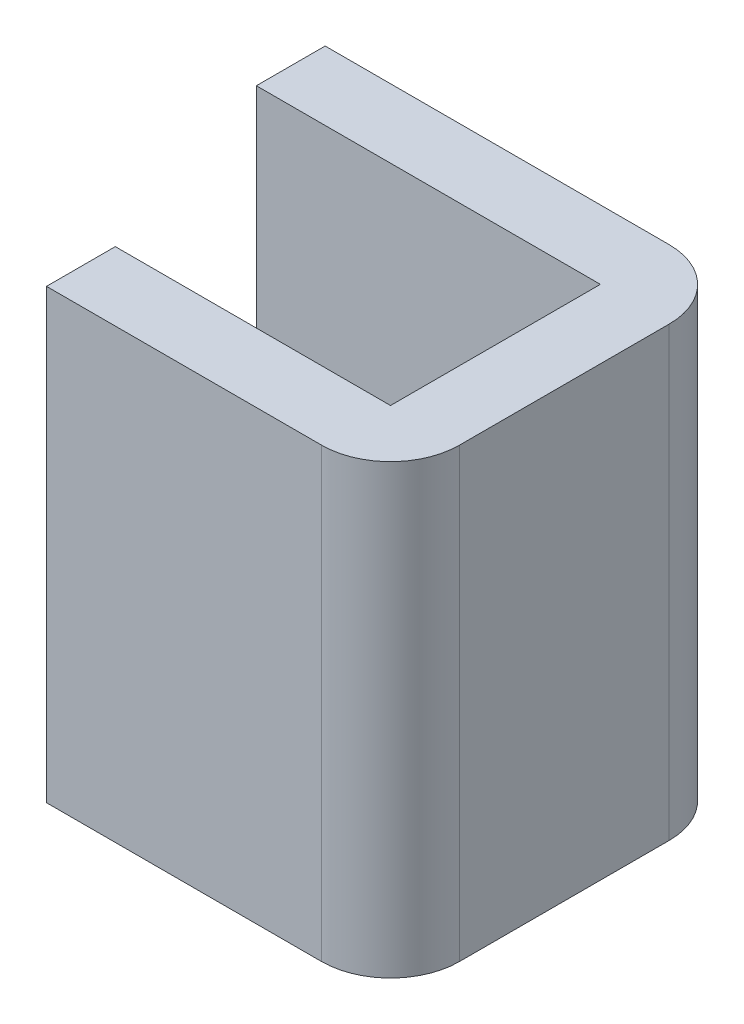
ISO-10303-21;
HEADER;
FILE_DESCRIPTION(('STEP AP214'),'2;1');
FILE_NAME('part.step','',(''),(''),'','','');
FILE_SCHEMA(('AUTOMOTIVE_DESIGN { 1 0 10303 214 1 1 1 1 }'));
ENDSEC;
DATA;
#1=APPLICATION_CONTEXT('core data for automotive mechanical design processes');
#2=APPLICATION_PROTOCOL_DEFINITION('international standard','automotive_design',2000,#1);
#3=PRODUCT_CONTEXT('',#1,'mechanical');
#4=PRODUCT('Part','Part','',(#3));
#5=PRODUCT_RELATED_PRODUCT_CATEGORY('part','',(#4));
#6=PRODUCT_DEFINITION_FORMATION('','',#4);
#7=PRODUCT_DEFINITION_CONTEXT('part definition',#1,'design');
#8=PRODUCT_DEFINITION('design','',#6,#7);
#9=PRODUCT_DEFINITION_SHAPE('','',#8);
#10=(LENGTH_UNIT() NAMED_UNIT(*) SI_UNIT(.MILLI.,.METRE.));
#11=(NAMED_UNIT(*) PLANE_ANGLE_UNIT() SI_UNIT($,.RADIAN.));
#12=(NAMED_UNIT(*) SI_UNIT($,.STERADIAN.) SOLID_ANGLE_UNIT());
#13=UNCERTAINTY_MEASURE_WITH_UNIT(LENGTH_MEASURE(1.E-05),#10,'distance_accuracy_value','');
#14=(GEOMETRIC_REPRESENTATION_CONTEXT(3) GLOBAL_UNCERTAINTY_ASSIGNED_CONTEXT((#13)) GLOBAL_UNIT_ASSIGNED_CONTEXT((#10,
#11,#12)) REPRESENTATION_CONTEXT('',''));
#15=CARTESIAN_POINT('',(0.,0.,0.));
#16=DIRECTION('',(0.,0.,1.));
#17=DIRECTION('',(1.,0.,0.));
#18=AXIS2_PLACEMENT_3D('',#15,#16,#17);
#19=CARTESIAN_POINT('',(0.575,0.,0.505));
#20=DIRECTION('',(0.,0.,1.));
#21=DIRECTION('',(1.,0.,0.));
#22=AXIS2_PLACEMENT_3D('',#19,#20,#21);
#23=PLANE('',#22);
#24=DIRECTION('',(-1.,0.,0.));
#25=VECTOR('',#24,1.);
#26=CARTESIAN_POINT('',(0.578986710963,0.325,0.505));
#27=LINE('',#26,#25);
#28=CARTESIAN_POINT('',(0.325,0.325,0.505));
#29=VERTEX_POINT('',#28);
#30=CARTESIAN_POINT('',(0.725,0.325,0.505));
#31=VERTEX_POINT('',#30);
#32=EDGE_CURVE('E149',#29,#31,#27,.F.);
#33=ORIENTED_EDGE('',*,*,#32,.F.);
#34=DIRECTION('',(0.,1.,0.));
#35=VECTOR('',#34,1.);
#36=CARTESIAN_POINT('',(0.325,-0.325,0.505));
#37=LINE('',#36,#35);
#38=CARTESIAN_POINT('',(0.325,-0.325,0.505));
#39=VERTEX_POINT('',#38);
#40=EDGE_CURVE('E78',#29,#39,#37,.F.);
#41=ORIENTED_EDGE('',*,*,#40,.T.);
#42=DIRECTION('',(1.,0.,0.));
#43=VECTOR('',#42,1.);
#44=CARTESIAN_POINT('',(0.578986710963,-0.325,0.505));
#45=LINE('',#44,#43);
#46=CARTESIAN_POINT('',(0.725,-0.325,0.505));
#47=VERTEX_POINT('',#46);
#48=EDGE_CURVE('E139',#47,#39,#45,.F.);
#49=ORIENTED_EDGE('',*,*,#48,.F.);
#50=DIRECTION('',(0.,1.,0.));
#51=VECTOR('',#50,1.);
#52=CARTESIAN_POINT('',(0.725,-0.325,0.505));
#53=LINE('',#52,#51);
#54=EDGE_CURVE('E70',#31,#47,#53,.F.);
#55=ORIENTED_EDGE('',*,*,#54,.F.);
#56=EDGE_LOOP('',(#33,#41,#49,#55));
#57=FACE_BOUND('',#56,.T.);
#58=ADVANCED_FACE('F17',(#57),#23,.T.);
#59=CARTESIAN_POINT('',(0.725,-0.325,0.405));
#60=DIRECTION('',(0.,1.,0.));
#61=DIRECTION('',(0.,0.,1.));
#62=AXIS2_PLACEMENT_3D('',#59,#60,#61);
#63=CYLINDRICAL_SURFACE('',#62,0.1);
#64=ORIENTED_EDGE('',*,*,#54,.T.);
#65=CARTESIAN_POINT('',(0.725,-0.325,0.405));
#66=DIRECTION('',(0.,1.,0.));
#67=DIRECTION('',(0.,0.,1.));
#68=AXIS2_PLACEMENT_3D('',#65,#66,#67);
#69=CIRCLE('',#68,0.1);
#70=CARTESIAN_POINT('',(0.825,-0.325,0.405));
#71=VERTEX_POINT('',#70);
#72=EDGE_CURVE('E20',#71,#47,#69,.F.);
#73=ORIENTED_EDGE('',*,*,#72,.F.);
#74=DIRECTION('',(0.,1.,0.));
#75=VECTOR('',#74,1.);
#76=CARTESIAN_POINT('',(0.825,-0.325,0.405));
#77=LINE('',#76,#75);
#78=CARTESIAN_POINT('',(0.825,0.325,0.405));
#79=VERTEX_POINT('',#78);
#80=EDGE_CURVE('E64',#79,#71,#77,.F.);
#81=ORIENTED_EDGE('',*,*,#80,.F.);
#82=CARTESIAN_POINT('',(0.725,0.325,0.405));
#83=DIRECTION('',(0.,1.,0.));
#84=DIRECTION('',(0.,0.,1.));
#85=AXIS2_PLACEMENT_3D('',#82,#83,#84);
#86=CIRCLE('',#85,0.1);
#87=EDGE_CURVE('E206',#31,#79,#86,.T.);
#88=ORIENTED_EDGE('',*,*,#87,.F.);
#89=EDGE_LOOP('',(#64,#73,#81,#88));
#90=FACE_BOUND('',#89,.T.);
#91=ADVANCED_FACE('F235',(#90),#63,.T.);
#92=CARTESIAN_POINT('',(0.225,-0.325,0.1));
#93=DIRECTION('',(0.,0.,1.));
#94=DIRECTION('',(1.,0.,0.));
#95=AXIS2_PLACEMENT_3D('',#92,#93,#94);
#96=PLANE('',#95);
#97=DIRECTION('',(0.,1.,0.));
#98=VECTOR('',#97,1.);
#99=CARTESIAN_POINT('',(0.725,-0.325,0.1));
#100=LINE('',#99,#98);
#101=CARTESIAN_POINT('',(0.725,-0.325,0.1));
#102=VERTEX_POINT('',#101);
#103=CARTESIAN_POINT('',(0.725,0.325,0.1));
#104=VERTEX_POINT('',#103);
#105=EDGE_CURVE('E100',#102,#104,#100,.T.);
#106=ORIENTED_EDGE('',*,*,#105,.T.);
#107=DIRECTION('',(-1.,0.,0.));
#108=VECTOR('',#107,1.);
#109=CARTESIAN_POINT('',(0.578986710963,0.325,0.1));
#110=LINE('',#109,#108);
#111=CARTESIAN_POINT('',(0.225,0.325,0.1));
#112=VERTEX_POINT('',#111);
#113=EDGE_CURVE('E152',#112,#104,#110,.F.);
#114=ORIENTED_EDGE('',*,*,#113,.F.);
#115=DIRECTION('',(0.,1.,0.));
#116=VECTOR('',#115,1.);
#117=CARTESIAN_POINT('',(0.225,-0.325,0.1));
#118=LINE('',#117,#116);
#119=CARTESIAN_POINT('',(0.225,-0.325,0.1));
#120=VERTEX_POINT('',#119);
#121=EDGE_CURVE('E107',#112,#120,#118,.F.);
#122=ORIENTED_EDGE('',*,*,#121,.T.);
#123=DIRECTION('',(1.,0.,0.));
#124=VECTOR('',#123,1.);
#125=CARTESIAN_POINT('',(0.578986710963,-0.325,0.1));
#126=LINE('',#125,#124);
#127=EDGE_CURVE('E119',#102,#120,#126,.F.);
#128=ORIENTED_EDGE('',*,*,#127,.F.);
#129=EDGE_LOOP('',(#106,#114,#122,#128));
#130=FACE_BOUND('',#129,.T.);
#131=ADVANCED_FACE('F223',(#130),#96,.T.);
#132=CARTESIAN_POINT('',(0.725,-0.325,0.));
#133=DIRECTION('',(1.,0.,0.));
#134=DIRECTION('',(0.,0.,-1.));
#135=AXIS2_PLACEMENT_3D('',#132,#133,#134);
#136=PLANE('',#135);
#137=DIRECTION('',(0.,0.,1.));
#138=VECTOR('',#137,1.);
#139=CARTESIAN_POINT('',(0.725,0.325,0.239044850498));
#140=LINE('',#139,#138);
#141=CARTESIAN_POINT('',(0.725,0.325,0.405));
#142=VERTEX_POINT('',#141);
#143=EDGE_CURVE('E155',#104,#142,#140,.T.);
#144=ORIENTED_EDGE('',*,*,#143,.F.);
#145=ORIENTED_EDGE('',*,*,#105,.F.);
#146=DIRECTION('',(0.,0.,-1.));
#147=VECTOR('',#146,1.);
#148=CARTESIAN_POINT('',(0.725,-0.325,0.239044850498));
#149=LINE('',#148,#147);
#150=CARTESIAN_POINT('',(0.725,-0.325,0.405));
#151=VERTEX_POINT('',#150);
#152=EDGE_CURVE('E172',#151,#102,#149,.T.);
#153=ORIENTED_EDGE('',*,*,#152,.F.);
#154=DIRECTION('',(0.,1.,0.));
#155=VECTOR('',#154,1.);
#156=CARTESIAN_POINT('',(0.725,-0.325,0.405));
#157=LINE('',#156,#155);
#158=EDGE_CURVE('E180',#151,#142,#157,.T.);
#159=ORIENTED_EDGE('',*,*,#158,.T.);
#160=EDGE_LOOP('',(#144,#145,#153,#159));
#161=FACE_BOUND('',#160,.T.);
#162=ADVANCED_FACE('F226',(#161),#136,.F.);
#163=CARTESIAN_POINT('',(0.325,-0.325,0.405));
#164=DIRECTION('',(0.,0.,1.));
#165=DIRECTION('',(1.,0.,0.));
#166=AXIS2_PLACEMENT_3D('',#163,#164,#165);
#167=PLANE('',#166);
#168=ORIENTED_EDGE('',*,*,#158,.F.);
#169=DIRECTION('',(1.,0.,0.));
#170=VECTOR('',#169,1.);
#171=CARTESIAN_POINT('',(0.578986710963,-0.325,0.405));
#172=LINE('',#171,#170);
#173=CARTESIAN_POINT('',(0.325,-0.325,0.405));
#174=VERTEX_POINT('',#173);
#175=EDGE_CURVE('E176',#174,#151,#172,.T.);
#176=ORIENTED_EDGE('',*,*,#175,.F.);
#177=DIRECTION('',(0.,1.,0.));
#178=VECTOR('',#177,1.);
#179=CARTESIAN_POINT('',(0.325,-0.325,0.405));
#180=LINE('',#179,#178);
#181=CARTESIAN_POINT('',(0.325,0.325,0.405));
#182=VERTEX_POINT('',#181);
#183=EDGE_CURVE('E161',#174,#182,#180,.T.);
#184=ORIENTED_EDGE('',*,*,#183,.T.);
#185=DIRECTION('',(-1.,0.,0.));
#186=VECTOR('',#185,1.);
#187=CARTESIAN_POINT('',(0.578986710963,0.325,0.405));
#188=LINE('',#187,#186);
#189=EDGE_CURVE('E168',#142,#182,#188,.T.);
#190=ORIENTED_EDGE('',*,*,#189,.F.);
#191=EDGE_LOOP('',(#168,#176,#184,#190));
#192=FACE_BOUND('',#191,.T.);
#193=ADVANCED_FACE('F230',(#192),#167,.F.);
#194=CARTESIAN_POINT('',(0.325,-0.325,0.405));
#195=DIRECTION('',(1.,0.,0.));
#196=DIRECTION('',(0.,0.,-1.));
#197=AXIS2_PLACEMENT_3D('',#194,#195,#196);
#198=PLANE('',#197);
#199=DIRECTION('',(0.,0.,1.));
#200=VECTOR('',#199,1.);
#201=CARTESIAN_POINT('',(0.325,0.325,0.239044850498));
#202=LINE('',#201,#200);
#203=EDGE_CURVE('E164',#182,#29,#202,.T.);
#204=ORIENTED_EDGE('',*,*,#203,.F.);
#205=ORIENTED_EDGE('',*,*,#183,.F.);
#206=DIRECTION('',(0.,0.,-1.));
#207=VECTOR('',#206,1.);
#208=CARTESIAN_POINT('',(0.325,-0.325,0.239044850498));
#209=LINE('',#208,#207);
#210=EDGE_CURVE('E142',#39,#174,#209,.T.);
#211=ORIENTED_EDGE('',*,*,#210,.F.);
#212=ORIENTED_EDGE('',*,*,#40,.F.);
#213=EDGE_LOOP('',(#204,#205,#211,#212));
#214=FACE_BOUND('',#213,.T.);
#215=ADVANCED_FACE('F233',(#214),#198,.F.);
#216=CARTESIAN_POINT('',(0.825,-0.325,0.));
#217=DIRECTION('',(1.,0.,0.));
#218=DIRECTION('',(0.,0.,-1.));
#219=AXIS2_PLACEMENT_3D('',#216,#217,#218);
#220=PLANE('',#219);
#221=DIRECTION('',(0.,0.,1.));
#222=VECTOR('',#221,1.);
#223=CARTESIAN_POINT('',(0.825,0.325,0.239044850498));
#224=LINE('',#223,#222);
#225=CARTESIAN_POINT('',(0.825,0.325,0.1));
#226=VERTEX_POINT('',#225);
#227=EDGE_CURVE('E208',#79,#226,#224,.F.);
#228=ORIENTED_EDGE('',*,*,#227,.F.);
#229=ORIENTED_EDGE('',*,*,#80,.T.);
#230=DIRECTION('',(0.,0.,-1.));
#231=VECTOR('',#230,1.);
#232=CARTESIAN_POINT('',(0.825,-0.325,0.239044850498));
#233=LINE('',#232,#231);
#234=CARTESIAN_POINT('',(0.825,-0.325,0.1));
#235=VERTEX_POINT('',#234);
#236=EDGE_CURVE('E145',#235,#71,#233,.F.);
#237=ORIENTED_EDGE('',*,*,#236,.F.);
#238=DIRECTION('',(0.,1.,0.));
#239=VECTOR('',#238,1.);
#240=CARTESIAN_POINT('',(0.825,-0.325,0.1));
#241=LINE('',#240,#239);
#242=EDGE_CURVE('E130',#226,#235,#241,.F.);
#243=ORIENTED_EDGE('',*,*,#242,.F.);
#244=EDGE_LOOP('',(#228,#229,#237,#243));
#245=FACE_BOUND('',#244,.T.);
#246=ADVANCED_FACE('F237',(#245),#220,.T.);
#247=CARTESIAN_POINT('',(0.578986710963,-0.325,0.239044850498));
#248=DIRECTION('',(0.,-1.,0.));
#249=DIRECTION('',(0.,0.,-1.));
#250=AXIS2_PLACEMENT_3D('',#247,#248,#249);
#251=PLANE('',#250);
#252=ORIENTED_EDGE('',*,*,#127,.T.);
#253=DIRECTION('',(0.,0.,-1.));
#254=VECTOR('',#253,1.);
#255=CARTESIAN_POINT('',(0.225,-0.325,0.));
#256=LINE('',#255,#254);
#257=CARTESIAN_POINT('',(0.225,-0.325,0.));
#258=VERTEX_POINT('',#257);
#259=EDGE_CURVE('E111',#120,#258,#256,.T.);
#260=ORIENTED_EDGE('',*,*,#259,.T.);
#261=DIRECTION('',(-1.,0.,0.));
#262=VECTOR('',#261,1.);
#263=CARTESIAN_POINT('',(0.525,-0.325,0.));
#264=LINE('',#263,#262);
#265=CARTESIAN_POINT('',(0.725,-0.325,0.));
#266=VERTEX_POINT('',#265);
#267=EDGE_CURVE('E116',#266,#258,#264,.T.);
#268=ORIENTED_EDGE('',*,*,#267,.F.);
#269=CARTESIAN_POINT('',(0.725,-0.325,0.1));
#270=DIRECTION('',(0.,1.,0.));
#271=DIRECTION('',(0.,0.,1.));
#272=AXIS2_PLACEMENT_3D('',#269,#270,#271);
#273=CIRCLE('',#272,0.1);
#274=EDGE_CURVE('E167',#235,#266,#273,.T.);
#275=ORIENTED_EDGE('',*,*,#274,.F.);
#276=ORIENTED_EDGE('',*,*,#236,.T.);
#277=ORIENTED_EDGE('',*,*,#72,.T.);
#278=ORIENTED_EDGE('',*,*,#48,.T.);
#279=ORIENTED_EDGE('',*,*,#210,.T.);
#280=ORIENTED_EDGE('',*,*,#175,.T.);
#281=ORIENTED_EDGE('',*,*,#152,.T.);
#282=EDGE_LOOP('',(#252,#260,#268,#275,#276,#277,#278,#279,#280,#281));
#283=FACE_BOUND('',#282,.T.);
#284=ADVANCED_FACE('F113',(#283),#251,.T.);
#285=CARTESIAN_POINT('',(0.225,-0.325,0.));
#286=DIRECTION('',(1.,0.,0.));
#287=DIRECTION('',(0.,0.,-1.));
#288=AXIS2_PLACEMENT_3D('',#285,#286,#287);
#289=PLANE('',#288);
#290=DIRECTION('',(0.,0.,1.));
#291=VECTOR('',#290,1.);
#292=CARTESIAN_POINT('',(0.225,0.325,0.239044850498));
#293=LINE('',#292,#291);
#294=CARTESIAN_POINT('',(0.225,0.325,0.));
#295=VERTEX_POINT('',#294);
#296=EDGE_CURVE('E125',#295,#112,#293,.T.);
#297=ORIENTED_EDGE('',*,*,#296,.F.);
#298=DIRECTION('',(0.,1.,0.));
#299=VECTOR('',#298,1.);
#300=CARTESIAN_POINT('',(0.225,0.,0.));
#301=LINE('',#300,#299);
#302=EDGE_CURVE('E122',#258,#295,#301,.T.);
#303=ORIENTED_EDGE('',*,*,#302,.F.);
#304=ORIENTED_EDGE('',*,*,#259,.F.);
#305=ORIENTED_EDGE('',*,*,#121,.F.);
#306=EDGE_LOOP('',(#297,#303,#304,#305));
#307=FACE_BOUND('',#306,.T.);
#308=ADVANCED_FACE('F123',(#307),#289,.F.);
#309=CARTESIAN_POINT('',(0.578986710963,0.325,0.239044850498));
#310=DIRECTION('',(0.,1.,0.));
#311=DIRECTION('',(-1.,0.,0.));
#312=AXIS2_PLACEMENT_3D('',#309,#310,#311);
#313=PLANE('',#312);
#314=ORIENTED_EDGE('',*,*,#189,.T.);
#315=ORIENTED_EDGE('',*,*,#203,.T.);
#316=ORIENTED_EDGE('',*,*,#32,.T.);
#317=ORIENTED_EDGE('',*,*,#87,.T.);
#318=ORIENTED_EDGE('',*,*,#227,.T.);
#319=CARTESIAN_POINT('',(0.725,0.325,0.1));
#320=DIRECTION('',(0.,1.,0.));
#321=DIRECTION('',(0.,0.,1.));
#322=AXIS2_PLACEMENT_3D('',#319,#320,#321);
#323=CIRCLE('',#322,0.1);
#324=CARTESIAN_POINT('',(0.725,0.325,0.));
#325=VERTEX_POINT('',#324);
#326=EDGE_CURVE('E35',#325,#226,#323,.F.);
#327=ORIENTED_EDGE('',*,*,#326,.F.);
#328=DIRECTION('',(-1.,0.,0.));
#329=VECTOR('',#328,1.);
#330=CARTESIAN_POINT('',(0.525,0.325,0.));
#331=LINE('',#330,#329);
#332=EDGE_CURVE('E26',#295,#325,#331,.F.);
#333=ORIENTED_EDGE('',*,*,#332,.F.);
#334=ORIENTED_EDGE('',*,*,#296,.T.);
#335=ORIENTED_EDGE('',*,*,#113,.T.);
#336=ORIENTED_EDGE('',*,*,#143,.T.);
#337=EDGE_LOOP('',(#314,#315,#316,#317,#318,#327,#333,#334,#335,#336));
#338=FACE_BOUND('',#337,.T.);
#339=ADVANCED_FACE('F222',(#338),#313,.T.);
#340=CARTESIAN_POINT('',(0.725,-0.325,0.1));
#341=DIRECTION('',(0.,1.,0.));
#342=DIRECTION('',(0.,0.,1.));
#343=AXIS2_PLACEMENT_3D('',#340,#341,#342);
#344=CYLINDRICAL_SURFACE('',#343,0.1);
#345=ORIENTED_EDGE('',*,*,#326,.T.);
#346=ORIENTED_EDGE('',*,*,#242,.T.);
#347=ORIENTED_EDGE('',*,*,#274,.T.);
#348=DIRECTION('',(0.,1.,0.));
#349=VECTOR('',#348,1.);
#350=CARTESIAN_POINT('',(0.725,0.,0.));
#351=LINE('',#350,#349);
#352=EDGE_CURVE('E11',#325,#266,#351,.F.);
#353=ORIENTED_EDGE('',*,*,#352,.F.);
#354=EDGE_LOOP('',(#345,#346,#347,#353));
#355=FACE_BOUND('',#354,.T.);
#356=ADVANCED_FACE('F239',(#355),#344,.T.);
#357=CARTESIAN_POINT('',(0.525,0.,0.));
#358=DIRECTION('',(0.,0.,-1.));
#359=DIRECTION('',(-1.,0.,0.));
#360=AXIS2_PLACEMENT_3D('',#357,#358,#359);
#361=PLANE('',#360);
#362=ORIENTED_EDGE('',*,*,#332,.T.);
#363=ORIENTED_EDGE('',*,*,#352,.T.);
#364=ORIENTED_EDGE('',*,*,#267,.T.);
#365=ORIENTED_EDGE('',*,*,#302,.T.);
#366=EDGE_LOOP('',(#362,#363,#364,#365));
#367=FACE_BOUND('',#366,.T.);
#368=ADVANCED_FACE('F129',(#367),#361,.T.);
#369=CLOSED_SHELL('',(#58,#91,#131,#162,#193,#215,#246,#284,#308,#339,#356,#368));
#370=MANIFOLD_SOLID_BREP('B1',#369);
#371=ADVANCED_BREP_SHAPE_REPRESENTATION('',(#18,#370),#14);
#372=SHAPE_DEFINITION_REPRESENTATION(#9,#371);
ENDSEC;
END-ISO-10303-21;
